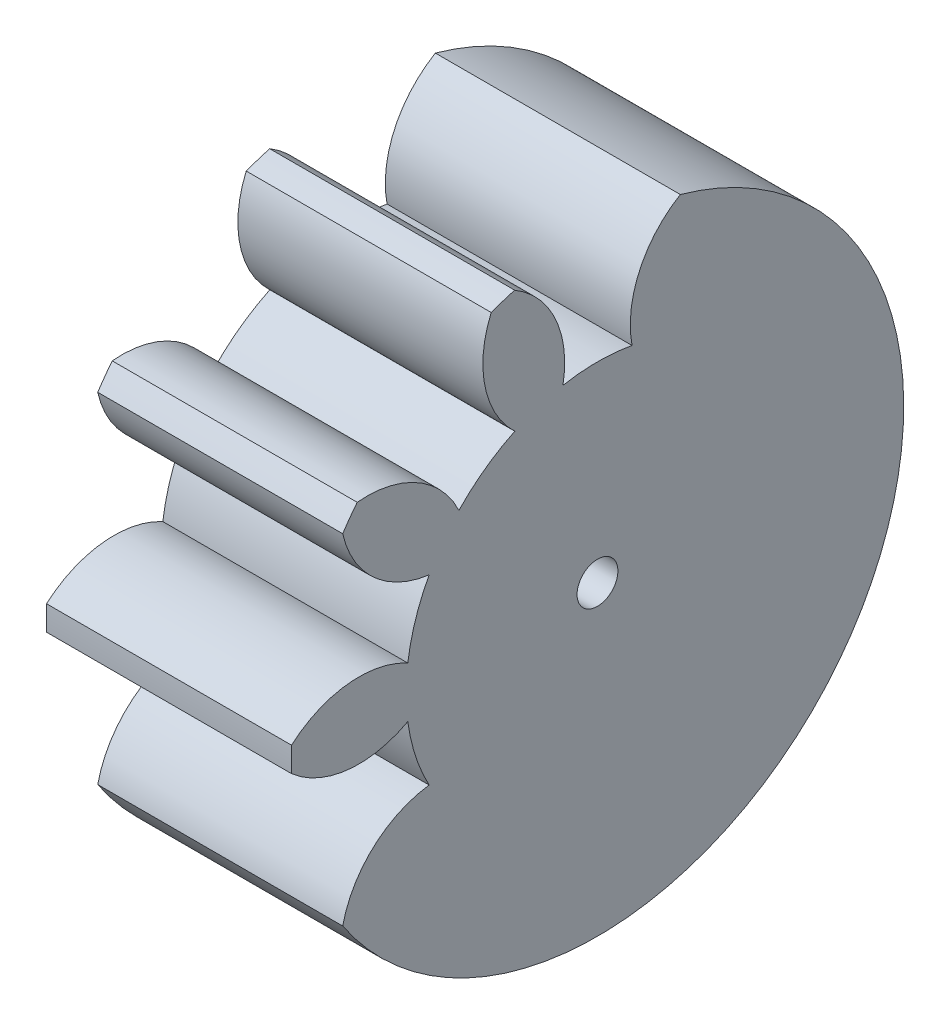
ISO-10303-21;
HEADER;
FILE_DESCRIPTION(('STEP AP214'),'2;1');
FILE_NAME('part.step','',(''),(''),'','','');
FILE_SCHEMA(('AUTOMOTIVE_DESIGN { 1 0 10303 214 1 1 1 1 }'));
ENDSEC;
DATA;
#1=APPLICATION_CONTEXT('core data for automotive mechanical design processes');
#2=APPLICATION_PROTOCOL_DEFINITION('international standard','automotive_design',2000,#1);
#3=PRODUCT_CONTEXT('',#1,'mechanical');
#4=PRODUCT('Part','Part','',(#3));
#5=PRODUCT_RELATED_PRODUCT_CATEGORY('part','',(#4));
#6=PRODUCT_DEFINITION_FORMATION('','',#4);
#7=PRODUCT_DEFINITION_CONTEXT('part definition',#1,'design');
#8=PRODUCT_DEFINITION('design','',#6,#7);
#9=PRODUCT_DEFINITION_SHAPE('','',#8);
#10=(LENGTH_UNIT() NAMED_UNIT(*) SI_UNIT(.MILLI.,.METRE.));
#11=(NAMED_UNIT(*) PLANE_ANGLE_UNIT() SI_UNIT($,.RADIAN.));
#12=(NAMED_UNIT(*) SI_UNIT($,.STERADIAN.) SOLID_ANGLE_UNIT());
#13=UNCERTAINTY_MEASURE_WITH_UNIT(LENGTH_MEASURE(1.E-05),#10,'distance_accuracy_value','');
#14=(GEOMETRIC_REPRESENTATION_CONTEXT(3) GLOBAL_UNCERTAINTY_ASSIGNED_CONTEXT((#13)) GLOBAL_UNIT_ASSIGNED_CONTEXT((#10,
#11,#12)) REPRESENTATION_CONTEXT('',''));
#15=CARTESIAN_POINT('',(0.,0.,0.));
#16=DIRECTION('',(0.,0.,1.));
#17=DIRECTION('',(1.,0.,0.));
#18=AXIS2_PLACEMENT_3D('',#15,#16,#17);
#19=CARTESIAN_POINT('',(12.,0.,0.));
#20=DIRECTION('',(-1.,0.,0.));
#21=DIRECTION('',(0.,0.,1.));
#22=AXIS2_PLACEMENT_3D('',#19,#20,#21);
#23=PLANE('',#22);
#24=CARTESIAN_POINT('',(12.,0.,0.));
#25=DIRECTION('',(-1.,0.,0.));
#26=DIRECTION('',(0.,0.,1.));
#27=AXIS2_PLACEMENT_3D('',#24,#25,#26);
#28=CIRCLE('',#27,0.999999999999999);
#29=CARTESIAN_POINT('',(12.,0.,0.999999999999999));
#30=VERTEX_POINT('',#29);
#31=EDGE_CURVE('E185',#30,#30,#28,.T.);
#32=ORIENTED_EDGE('',*,*,#31,.T.);
#33=EDGE_LOOP('',(#32));
#34=FACE_BOUND('',#33,.T.);
#35=CARTESIAN_POINT('',(12.,9.4163305871234,7.60180129417859));
#36=DIRECTION('',(-1.,0.,0.));
#37=DIRECTION('',(0.,0.951056516295155,-0.309016994374945));
#38=AXIS2_PLACEMENT_3D('',#35,#36,#37);
#39=CIRCLE('',#38,5.);
#40=CARTESIAN_POINT('',(12.,4.45801496955042,8.24608868077857));
#41=VERTEX_POINT('',#40);
#42=CARTESIAN_POINT('',(12.,8.32108039729011,12.4803694264967));
#43=VERTEX_POINT('',#42);
#44=EDGE_CURVE('E157',#41,#43,#39,.T.);
#45=ORIENTED_EDGE('',*,*,#44,.F.);
#46=CARTESIAN_POINT('',(12.,0.,0.));
#47=DIRECTION('',(-1.,0.,0.));
#48=DIRECTION('',(0.,0.951056516295155,-0.309016994374945));
#49=AXIS2_PLACEMENT_3D('',#46,#47,#48);
#50=CIRCLE('',#49,9.374);
#51=CARTESIAN_POINT('',(12.,1.24031944411328,9.29158133347357));
#52=VERTEX_POINT('',#51);
#53=EDGE_CURVE('E156',#52,#41,#50,.T.);
#54=ORIENTED_EDGE('',*,*,#53,.F.);
#55=CARTESIAN_POINT('',(12.,-3.14974477805952,11.6847666846736));
#56=DIRECTION('',(-1.,0.,0.));
#57=DIRECTION('',(0.,0.951056516295155,-0.309016994374945));
#58=AXIS2_PLACEMENT_3D('',#55,#56,#57);
#59=CIRCLE('',#58,5.);
#60=CARTESIAN_POINT('',(12.,0.603881639088625,14.9878393027805));
#61=VERTEX_POINT('',#60);
#62=EDGE_CURVE('E145',#61,#52,#59,.T.);
#63=ORIENTED_EDGE('',*,*,#62,.F.);
#64=CARTESIAN_POINT('',(12.,0.,0.));
#65=DIRECTION('',(-1.,0.,0.));
#66=DIRECTION('',(0.,0.,1.));
#67=AXIS2_PLACEMENT_3D('',#64,#65,#66);
#68=CIRCLE('',#67,15.);
#69=CARTESIAN_POINT('',(12.,-0.603881639088732,14.9878393027805));
#70=VERTEX_POINT('',#69);
#71=EDGE_CURVE('E251',#70,#61,#68,.T.);
#72=ORIENTED_EDGE('',*,*,#71,.F.);
#73=CARTESIAN_POINT('',(12.,3.14974477805943,11.6847666846736));
#74=DIRECTION('',(-1.,0.,0.));
#75=DIRECTION('',(0.,0.951056516295152,0.309016994374952));
#76=AXIS2_PLACEMENT_3D('',#73,#74,#75);
#77=CIRCLE('',#76,5.);
#78=CARTESIAN_POINT('',(12.,-1.24031944411335,9.29158133347356));
#79=VERTEX_POINT('',#78);
#80=EDGE_CURVE('E176',#79,#70,#77,.T.);
#81=ORIENTED_EDGE('',*,*,#80,.F.);
#82=CARTESIAN_POINT('',(12.,0.,0.));
#83=DIRECTION('',(-1.,0.,0.));
#84=DIRECTION('',(0.,0.951056516295152,0.309016994374952));
#85=AXIS2_PLACEMENT_3D('',#82,#83,#84);
#86=CIRCLE('',#85,9.374);
#87=CARTESIAN_POINT('',(12.,-4.45801496955048,8.24608868077853));
#88=VERTEX_POINT('',#87);
#89=EDGE_CURVE('E181',#88,#79,#86,.T.);
#90=ORIENTED_EDGE('',*,*,#89,.F.);
#91=CARTESIAN_POINT('',(12.,-9.41633058712346,7.60180129417852));
#92=DIRECTION('',(-1.,0.,0.));
#93=DIRECTION('',(0.,0.951056516295152,0.309016994374952));
#94=AXIS2_PLACEMENT_3D('',#91,#92,#93);
#95=CIRCLE('',#94,5.);
#96=CARTESIAN_POINT('',(12.,-8.3210803972902,12.4803694264967));
#97=VERTEX_POINT('',#96);
#98=EDGE_CURVE('E178',#97,#88,#95,.T.);
#99=ORIENTED_EDGE('',*,*,#98,.F.);
#100=CARTESIAN_POINT('',(12.,14.4408919231634,-4.05717148559366));
#101=VERTEX_POINT('',#100);
#102=EDGE_CURVE('E247',#101,#97,#68,.T.);
#103=ORIENTED_EDGE('',*,*,#102,.F.);
#104=CARTESIAN_POINT('',(12.,10.1395488324832,-6.60637677671046));
#105=DIRECTION('',(-1.,0.,0.));
#106=DIRECTION('',(0.,0.,-1.));
#107=AXIS2_PLACEMENT_3D('',#104,#105,#106);
#108=CIRCLE('',#107,5.);
#109=CARTESIAN_POINT('',(12.,9.22009876057115,-1.69164264704882));
#110=VERTEX_POINT('',#109);
#111=EDGE_CURVE('E219',#110,#101,#108,.T.);
#112=ORIENTED_EDGE('',*,*,#111,.F.);
#113=CARTESIAN_POINT('',(12.,0.,0.));
#114=DIRECTION('',(-1.,0.,0.));
#115=DIRECTION('',(0.,0.,-1.));
#116=AXIS2_PLACEMENT_3D('',#113,#114,#115);
#117=CIRCLE('',#116,9.374);
#118=CARTESIAN_POINT('',(12.,9.22009876057115,1.69164264704882));
#119=VERTEX_POINT('',#118);
#120=EDGE_CURVE('E224',#119,#110,#117,.T.);
#121=ORIENTED_EDGE('',*,*,#120,.F.);
#122=CARTESIAN_POINT('',(12.,10.1395488324832,6.60637677671046));
#123=DIRECTION('',(-1.,0.,0.));
#124=DIRECTION('',(0.,0.,-1.));
#125=AXIS2_PLACEMENT_3D('',#122,#123,#124);
#126=CIRCLE('',#125,5.);
#127=CARTESIAN_POINT('',(12.,14.4408919231634,4.05717148559366));
#128=VERTEX_POINT('',#127);
#129=EDGE_CURVE('E221',#128,#119,#126,.T.);
#130=ORIENTED_EDGE('',*,*,#129,.F.);
#131=CARTESIAN_POINT('',(12.,14.0676725450246,5.20582262144623));
#132=VERTEX_POINT('',#131);
#133=EDGE_CURVE('E244',#132,#128,#68,.T.);
#134=ORIENTED_EDGE('',*,*,#133,.F.);
#135=CARTESIAN_POINT('',(12.,12.0861981612115,0.615206185030265));
#136=DIRECTION('',(-1.,0.,0.));
#137=DIRECTION('',(0.,0.587785252292474,-0.809016994374947));
#138=AXIS2_PLACEMENT_3D('',#135,#136,#137);
#139=CIRCLE('',#138,5.);
#140=CARTESIAN_POINT('',(12.,8.45353918720174,4.05087042627193));
#141=VERTEX_POINT('',#140);
#142=EDGE_CURVE('E197',#141,#132,#139,.T.);
#143=ORIENTED_EDGE('',*,*,#142,.F.);
#144=CARTESIAN_POINT('',(12.,0.,0.));
#145=DIRECTION('',(-1.,0.,0.));
#146=DIRECTION('',(0.,0.587785252292474,-0.809016994374947));
#147=AXIS2_PLACEMENT_3D('',#144,#145,#146);
#148=CIRCLE('',#147,9.374);
#149=CARTESIAN_POINT('',(12.,6.46489398703314,6.78800572601576));
#150=VERTEX_POINT('',#149);
#151=EDGE_CURVE('E202',#150,#141,#148,.T.);
#152=ORIENTED_EDGE('',*,*,#151,.F.);
#153=CARTESIAN_POINT('',(12.,4.31993648033567,11.3045483522358));
#154=DIRECTION('',(-1.,0.,0.));
#155=DIRECTION('',(0.,0.587785252292474,-0.809016994374947));
#156=AXIS2_PLACEMENT_3D('',#153,#154,#155);
#157=CIRCLE('',#156,5.);
#158=CARTESIAN_POINT('',(12.,9.29818141451759,11.7704639833237));
#159=VERTEX_POINT('',#158);
#160=EDGE_CURVE('E199',#159,#150,#157,.T.);
#161=ORIENTED_EDGE('',*,*,#160,.F.);
#162=EDGE_CURVE('E252',#43,#159,#68,.T.);
#163=ORIENTED_EDGE('',*,*,#162,.F.);
#164=EDGE_LOOP('',(#45,#54,#63,#72,#81,#90,#99,#103,#112,#121,#130,#134,#143,#152,#161,#163));
#165=FACE_BOUND('',#164,.T.);
#166=ADVANCED_FACE('F33',(#34,#165),#23,.F.);
#167=CARTESIAN_POINT('',(-10.,0.,0.));
#168=DIRECTION('',(-1.,0.,0.));
#169=DIRECTION('',(0.,0.,1.));
#170=AXIS2_PLACEMENT_3D('',#167,#168,#169);
#171=CYLINDRICAL_SURFACE('',#170,15.);
#172=DIRECTION('',(-1.,0.,0.));
#173=VECTOR('',#172,1.);
#174=CARTESIAN_POINT('',(6.,8.32108039729011,12.4803694264967));
#175=LINE('',#174,#173);
#176=CARTESIAN_POINT('',(0.,8.32108039729011,12.4803694264967));
#177=VERTEX_POINT('',#176);
#178=EDGE_CURVE('E194',#43,#177,#175,.T.);
#179=ORIENTED_EDGE('',*,*,#178,.F.);
#180=ORIENTED_EDGE('',*,*,#162,.T.);
#181=DIRECTION('',(-1.,0.,0.));
#182=VECTOR('',#181,1.);
#183=CARTESIAN_POINT('',(6.,9.29818141451759,11.7704639833237));
#184=LINE('',#183,#182);
#185=CARTESIAN_POINT('',(0.,9.29818141451759,11.7704639833237));
#186=VERTEX_POINT('',#185);
#187=EDGE_CURVE('E213',#186,#159,#184,.F.);
#188=ORIENTED_EDGE('',*,*,#187,.F.);
#189=CARTESIAN_POINT('',(0.,0.,0.));
#190=DIRECTION('',(-1.,0.,0.));
#191=DIRECTION('',(0.,0.,1.));
#192=AXIS2_PLACEMENT_3D('',#189,#190,#191);
#193=CIRCLE('',#192,15.);
#194=EDGE_CURVE('E246',#177,#186,#193,.T.);
#195=ORIENTED_EDGE('',*,*,#194,.F.);
#196=EDGE_LOOP('',(#179,#180,#188,#195));
#197=FACE_BOUND('',#196,.T.);
#198=ADVANCED_FACE('F313',(#197),#171,.T.);
#199=DIRECTION('',(-1.,0.,0.));
#200=VECTOR('',#199,1.);
#201=CARTESIAN_POINT('',(6.,0.603881639088625,14.9878393027805));
#202=LINE('',#201,#200);
#203=CARTESIAN_POINT('',(0.,0.603881639088625,14.9878393027805));
#204=VERTEX_POINT('',#203);
#205=EDGE_CURVE('E151',#204,#61,#202,.F.);
#206=ORIENTED_EDGE('',*,*,#205,.F.);
#207=CARTESIAN_POINT('',(0.,-0.603881639088732,14.9878393027805));
#208=VERTEX_POINT('',#207);
#209=EDGE_CURVE('E245',#208,#204,#193,.T.);
#210=ORIENTED_EDGE('',*,*,#209,.F.);
#211=DIRECTION('',(-1.,0.,0.));
#212=VECTOR('',#211,1.);
#213=CARTESIAN_POINT('',(6.,-0.603881639088732,14.9878393027805));
#214=LINE('',#213,#212);
#215=EDGE_CURVE('E191',#70,#208,#214,.T.);
#216=ORIENTED_EDGE('',*,*,#215,.F.);
#217=ORIENTED_EDGE('',*,*,#71,.T.);
#218=EDGE_LOOP('',(#206,#210,#216,#217));
#219=FACE_BOUND('',#218,.T.);
#220=ADVANCED_FACE('F291',(#219),#171,.T.);
#221=DIRECTION('',(-1.,0.,0.));
#222=VECTOR('',#221,1.);
#223=CARTESIAN_POINT('',(6.,-8.3210803972902,12.4803694264967));
#224=LINE('',#223,#222);
#225=CARTESIAN_POINT('',(0.,-8.3210803972902,12.4803694264967));
#226=VERTEX_POINT('',#225);
#227=EDGE_CURVE('E164',#226,#97,#224,.F.);
#228=ORIENTED_EDGE('',*,*,#227,.F.);
#229=CARTESIAN_POINT('',(0.,14.4408919231634,-4.05717148559366));
#230=VERTEX_POINT('',#229);
#231=EDGE_CURVE('E241',#230,#226,#193,.T.);
#232=ORIENTED_EDGE('',*,*,#231,.F.);
#233=DIRECTION('',(-1.,0.,0.));
#234=VECTOR('',#233,1.);
#235=CARTESIAN_POINT('',(6.,14.4408919231634,-4.05717148559366));
#236=LINE('',#235,#234);
#237=EDGE_CURVE('E238',#101,#230,#236,.T.);
#238=ORIENTED_EDGE('',*,*,#237,.F.);
#239=ORIENTED_EDGE('',*,*,#102,.T.);
#240=EDGE_LOOP('',(#228,#232,#238,#239));
#241=FACE_BOUND('',#240,.T.);
#242=ADVANCED_FACE('F267',(#241),#171,.T.);
#243=CARTESIAN_POINT('',(0.,0.,0.));
#244=DIRECTION('',(1.,0.,0.));
#245=DIRECTION('',(0.,0.,-1.));
#246=AXIS2_PLACEMENT_3D('',#243,#244,#245);
#247=PLANE('',#246);
#248=CARTESIAN_POINT('',(0.,0.,0.));
#249=DIRECTION('',(-1.,0.,0.));
#250=DIRECTION('',(0.,0.,1.));
#251=AXIS2_PLACEMENT_3D('',#248,#249,#250);
#252=CIRCLE('',#251,0.999999999999999);
#253=CARTESIAN_POINT('',(0.,0.,0.999999999999999));
#254=VERTEX_POINT('',#253);
#255=EDGE_CURVE('E322',#254,#254,#252,.T.);
#256=ORIENTED_EDGE('',*,*,#255,.F.);
#257=EDGE_LOOP('',(#256));
#258=FACE_BOUND('',#257,.T.);
#259=CARTESIAN_POINT('',(0.,9.4163305871234,7.60180129417859));
#260=DIRECTION('',(-1.,0.,0.));
#261=DIRECTION('',(0.,0.951056516295155,-0.309016994374945));
#262=AXIS2_PLACEMENT_3D('',#259,#260,#261);
#263=CIRCLE('',#262,5.);
#264=CARTESIAN_POINT('',(0.,4.45801496955042,8.24608868077856));
#265=VERTEX_POINT('',#264);
#266=EDGE_CURVE('E47',#265,#177,#263,.T.);
#267=ORIENTED_EDGE('',*,*,#266,.T.);
#268=ORIENTED_EDGE('',*,*,#194,.T.);
#269=CARTESIAN_POINT('',(0.,4.31993648033567,11.3045483522358));
#270=DIRECTION('',(1.,0.,0.));
#271=DIRECTION('',(0.,0.,-1.));
#272=AXIS2_PLACEMENT_3D('',#269,#270,#271);
#273=CIRCLE('',#272,5.);
#274=CARTESIAN_POINT('',(0.,6.46489398703314,6.78800572601576));
#275=VERTEX_POINT('',#274);
#276=EDGE_CURVE('E255',#275,#186,#273,.T.);
#277=ORIENTED_EDGE('',*,*,#276,.F.);
#278=CARTESIAN_POINT('',(0.,0.,0.));
#279=DIRECTION('',(-1.,0.,0.));
#280=DIRECTION('',(0.,0.587785252292474,-0.809016994374947));
#281=AXIS2_PLACEMENT_3D('',#278,#279,#280);
#282=CIRCLE('',#281,9.374);
#283=CARTESIAN_POINT('',(0.,8.45353918720174,4.05087042627192));
#284=VERTEX_POINT('',#283);
#285=EDGE_CURVE('E200',#275,#284,#282,.T.);
#286=ORIENTED_EDGE('',*,*,#285,.T.);
#287=CARTESIAN_POINT('',(0.,12.0861981612115,0.615206185030265));
#288=DIRECTION('',(-1.,0.,0.));
#289=DIRECTION('',(0.,0.587785252292474,-0.809016994374947));
#290=AXIS2_PLACEMENT_3D('',#287,#288,#289);
#291=CIRCLE('',#290,5.);
#292=CARTESIAN_POINT('',(0.,14.0676725450246,5.20582262144623));
#293=VERTEX_POINT('',#292);
#294=EDGE_CURVE('E196',#284,#293,#291,.T.);
#295=ORIENTED_EDGE('',*,*,#294,.T.);
#296=CARTESIAN_POINT('',(0.,14.4408919231634,4.05717148559366));
#297=VERTEX_POINT('',#296);
#298=EDGE_CURVE('E240',#293,#297,#193,.T.);
#299=ORIENTED_EDGE('',*,*,#298,.T.);
#300=CARTESIAN_POINT('',(0.,10.1395488324832,6.60637677671046));
#301=DIRECTION('',(1.,0.,0.));
#302=DIRECTION('',(0.,0.,-1.));
#303=AXIS2_PLACEMENT_3D('',#300,#301,#302);
#304=CIRCLE('',#303,5.);
#305=CARTESIAN_POINT('',(0.,9.22009876057115,1.69164264704882));
#306=VERTEX_POINT('',#305);
#307=EDGE_CURVE('E250',#306,#297,#304,.T.);
#308=ORIENTED_EDGE('',*,*,#307,.F.);
#309=CARTESIAN_POINT('',(0.,0.,0.));
#310=DIRECTION('',(-1.,0.,0.));
#311=DIRECTION('',(0.,0.,-1.));
#312=AXIS2_PLACEMENT_3D('',#309,#310,#311);
#313=CIRCLE('',#312,9.374);
#314=CARTESIAN_POINT('',(0.,9.22009876057115,-1.69164264704882));
#315=VERTEX_POINT('',#314);
#316=EDGE_CURVE('E222',#306,#315,#313,.T.);
#317=ORIENTED_EDGE('',*,*,#316,.T.);
#318=CARTESIAN_POINT('',(0.,10.1395488324832,-6.60637677671046));
#319=DIRECTION('',(-1.,0.,0.));
#320=DIRECTION('',(0.,0.,-1.));
#321=AXIS2_PLACEMENT_3D('',#318,#319,#320);
#322=CIRCLE('',#321,5.);
#323=EDGE_CURVE('E218',#315,#230,#322,.T.);
#324=ORIENTED_EDGE('',*,*,#323,.T.);
#325=ORIENTED_EDGE('',*,*,#231,.T.);
#326=CARTESIAN_POINT('',(0.,-9.41633058712346,7.60180129417852));
#327=DIRECTION('',(1.,0.,0.));
#328=DIRECTION('',(0.,0.,-1.));
#329=AXIS2_PLACEMENT_3D('',#326,#327,#328);
#330=CIRCLE('',#329,5.);
#331=CARTESIAN_POINT('',(0.,-4.45801496955048,8.24608868077853));
#332=VERTEX_POINT('',#331);
#333=EDGE_CURVE('E40',#332,#226,#330,.T.);
#334=ORIENTED_EDGE('',*,*,#333,.F.);
#335=CARTESIAN_POINT('',(0.,0.,0.));
#336=DIRECTION('',(-1.,0.,0.));
#337=DIRECTION('',(0.,0.951056516295152,0.309016994374952));
#338=AXIS2_PLACEMENT_3D('',#335,#336,#337);
#339=CIRCLE('',#338,9.374);
#340=CARTESIAN_POINT('',(0.,-1.24031944411335,9.29158133347356));
#341=VERTEX_POINT('',#340);
#342=EDGE_CURVE('E179',#332,#341,#339,.T.);
#343=ORIENTED_EDGE('',*,*,#342,.T.);
#344=CARTESIAN_POINT('',(0.,3.14974477805943,11.6847666846736));
#345=DIRECTION('',(-1.,0.,0.));
#346=DIRECTION('',(0.,0.951056516295152,0.309016994374952));
#347=AXIS2_PLACEMENT_3D('',#344,#345,#346);
#348=CIRCLE('',#347,5.);
#349=EDGE_CURVE('E55',#341,#208,#348,.T.);
#350=ORIENTED_EDGE('',*,*,#349,.T.);
#351=ORIENTED_EDGE('',*,*,#209,.T.);
#352=CARTESIAN_POINT('',(0.,-3.14974477805952,11.6847666846736));
#353=DIRECTION('',(1.,0.,0.));
#354=DIRECTION('',(0.,0.,-1.));
#355=AXIS2_PLACEMENT_3D('',#352,#353,#354);
#356=CIRCLE('',#355,5.);
#357=CARTESIAN_POINT('',(0.,1.24031944411328,9.29158133347357));
#358=VERTEX_POINT('',#357);
#359=EDGE_CURVE('E11',#358,#204,#356,.T.);
#360=ORIENTED_EDGE('',*,*,#359,.F.);
#361=CARTESIAN_POINT('',(0.,0.,0.));
#362=DIRECTION('',(-1.,0.,0.));
#363=DIRECTION('',(0.,0.951056516295155,-0.309016994374945));
#364=AXIS2_PLACEMENT_3D('',#361,#362,#363);
#365=CIRCLE('',#364,9.374);
#366=EDGE_CURVE('E162',#358,#265,#365,.T.);
#367=ORIENTED_EDGE('',*,*,#366,.T.);
#368=EDGE_LOOP('',(#267,#268,#277,#286,#295,#299,#308,#317,#324,#325,#334,#343,#350,#351,#360,#367));
#369=FACE_BOUND('',#368,.T.);
#370=ADVANCED_FACE('F270',(#258,#369),#247,.F.);
#371=DIRECTION('',(-1.,0.,0.));
#372=VECTOR('',#371,1.);
#373=CARTESIAN_POINT('',(6.,14.0676725450246,5.20582262144623));
#374=LINE('',#373,#372);
#375=EDGE_CURVE('E216',#132,#293,#374,.T.);
#376=ORIENTED_EDGE('',*,*,#375,.F.);
#377=ORIENTED_EDGE('',*,*,#133,.T.);
#378=DIRECTION('',(-1.,0.,0.));
#379=VECTOR('',#378,1.);
#380=CARTESIAN_POINT('',(6.,14.4408919231634,4.05717148559366));
#381=LINE('',#380,#379);
#382=EDGE_CURVE('E235',#297,#128,#381,.F.);
#383=ORIENTED_EDGE('',*,*,#382,.F.);
#384=ORIENTED_EDGE('',*,*,#298,.F.);
#385=EDGE_LOOP('',(#376,#377,#383,#384));
#386=FACE_BOUND('',#385,.T.);
#387=ADVANCED_FACE('F298',(#386),#171,.T.);
#388=CARTESIAN_POINT('',(12.,10.1395488324832,-6.60637677671046));
#389=DIRECTION('',(-1.,0.,0.));
#390=DIRECTION('',(0.,0.,1.));
#391=AXIS2_PLACEMENT_3D('',#388,#389,#390);
#392=CYLINDRICAL_SURFACE('',#391,5.);
#393=ORIENTED_EDGE('',*,*,#237,.T.);
#394=ORIENTED_EDGE('',*,*,#323,.F.);
#395=DIRECTION('',(-1.,0.,0.));
#396=VECTOR('',#395,1.);
#397=CARTESIAN_POINT('',(12.,9.22009876057115,-1.69164264704882));
#398=LINE('',#397,#396);
#399=EDGE_CURVE('E226',#110,#315,#398,.T.);
#400=ORIENTED_EDGE('',*,*,#399,.F.);
#401=ORIENTED_EDGE('',*,*,#111,.T.);
#402=EDGE_LOOP('',(#393,#394,#400,#401));
#403=FACE_BOUND('',#402,.T.);
#404=ADVANCED_FACE('F275',(#403),#392,.T.);
#405=CARTESIAN_POINT('',(12.,10.1395488324832,6.60637677671046));
#406=DIRECTION('',(-1.,0.,0.));
#407=DIRECTION('',(0.,0.,1.));
#408=AXIS2_PLACEMENT_3D('',#405,#406,#407);
#409=CYLINDRICAL_SURFACE('',#408,5.);
#410=ORIENTED_EDGE('',*,*,#382,.T.);
#411=ORIENTED_EDGE('',*,*,#129,.T.);
#412=DIRECTION('',(-1.,0.,0.));
#413=VECTOR('',#412,1.);
#414=CARTESIAN_POINT('',(12.,9.22009876057115,1.69164264704882));
#415=LINE('',#414,#413);
#416=EDGE_CURVE('E233',#119,#306,#415,.T.);
#417=ORIENTED_EDGE('',*,*,#416,.T.);
#418=ORIENTED_EDGE('',*,*,#307,.T.);
#419=EDGE_LOOP('',(#410,#411,#417,#418));
#420=FACE_BOUND('',#419,.T.);
#421=ADVANCED_FACE('F297',(#420),#409,.T.);
#422=CARTESIAN_POINT('',(12.,0.,0.));
#423=DIRECTION('',(-1.,0.,0.));
#424=DIRECTION('',(0.,0.,1.));
#425=AXIS2_PLACEMENT_3D('',#422,#423,#424);
#426=CYLINDRICAL_SURFACE('',#425,9.374);
#427=ORIENTED_EDGE('',*,*,#316,.F.);
#428=ORIENTED_EDGE('',*,*,#416,.F.);
#429=ORIENTED_EDGE('',*,*,#120,.T.);
#430=ORIENTED_EDGE('',*,*,#399,.T.);
#431=EDGE_LOOP('',(#427,#428,#429,#430));
#432=FACE_BOUND('',#431,.T.);
#433=ADVANCED_FACE('F278',(#432),#426,.T.);
#434=CARTESIAN_POINT('',(12.,12.0861981612115,0.615206185030265));
#435=DIRECTION('',(-1.,0.,0.));
#436=DIRECTION('',(0.,0.,1.));
#437=AXIS2_PLACEMENT_3D('',#434,#435,#436);
#438=CYLINDRICAL_SURFACE('',#437,5.);
#439=ORIENTED_EDGE('',*,*,#375,.T.);
#440=ORIENTED_EDGE('',*,*,#294,.F.);
#441=DIRECTION('',(-1.,0.,0.));
#442=VECTOR('',#441,1.);
#443=CARTESIAN_POINT('',(12.,8.45353918720174,4.05087042627193));
#444=LINE('',#443,#442);
#445=EDGE_CURVE('E204',#141,#284,#444,.T.);
#446=ORIENTED_EDGE('',*,*,#445,.F.);
#447=ORIENTED_EDGE('',*,*,#142,.T.);
#448=EDGE_LOOP('',(#439,#440,#446,#447));
#449=FACE_BOUND('',#448,.T.);
#450=ADVANCED_FACE('F338',(#449),#438,.T.);
#451=CARTESIAN_POINT('',(12.,4.31993648033567,11.3045483522358));
#452=DIRECTION('',(-1.,0.,0.));
#453=DIRECTION('',(0.,0.,1.));
#454=AXIS2_PLACEMENT_3D('',#451,#452,#453);
#455=CYLINDRICAL_SURFACE('',#454,5.);
#456=ORIENTED_EDGE('',*,*,#187,.T.);
#457=ORIENTED_EDGE('',*,*,#160,.T.);
#458=DIRECTION('',(-1.,0.,0.));
#459=VECTOR('',#458,1.);
#460=CARTESIAN_POINT('',(12.,6.46489398703314,6.78800572601576));
#461=LINE('',#460,#459);
#462=EDGE_CURVE('E211',#150,#275,#461,.T.);
#463=ORIENTED_EDGE('',*,*,#462,.T.);
#464=ORIENTED_EDGE('',*,*,#276,.T.);
#465=EDGE_LOOP('',(#456,#457,#463,#464));
#466=FACE_BOUND('',#465,.T.);
#467=ADVANCED_FACE('F309',(#466),#455,.T.);
#468=CARTESIAN_POINT('',(12.,0.,0.));
#469=DIRECTION('',(-1.,0.,0.));
#470=DIRECTION('',(0.,0.,1.));
#471=AXIS2_PLACEMENT_3D('',#468,#469,#470);
#472=CYLINDRICAL_SURFACE('',#471,9.374);
#473=ORIENTED_EDGE('',*,*,#285,.F.);
#474=ORIENTED_EDGE('',*,*,#462,.F.);
#475=ORIENTED_EDGE('',*,*,#151,.T.);
#476=ORIENTED_EDGE('',*,*,#445,.T.);
#477=EDGE_LOOP('',(#473,#474,#475,#476));
#478=FACE_BOUND('',#477,.T.);
#479=ADVANCED_FACE('F302',(#478),#472,.T.);
#480=CARTESIAN_POINT('',(12.,3.14974477805943,11.6847666846736));
#481=DIRECTION('',(-1.,0.,0.));
#482=DIRECTION('',(0.,0.,1.));
#483=AXIS2_PLACEMENT_3D('',#480,#481,#482);
#484=CYLINDRICAL_SURFACE('',#483,5.);
#485=ORIENTED_EDGE('',*,*,#215,.T.);
#486=ORIENTED_EDGE('',*,*,#349,.F.);
#487=DIRECTION('',(-1.,0.,0.));
#488=VECTOR('',#487,1.);
#489=CARTESIAN_POINT('',(12.,-1.24031944411335,9.29158133347356));
#490=LINE('',#489,#488);
#491=EDGE_CURVE('E183',#79,#341,#490,.T.);
#492=ORIENTED_EDGE('',*,*,#491,.F.);
#493=ORIENTED_EDGE('',*,*,#80,.T.);
#494=EDGE_LOOP('',(#485,#486,#492,#493));
#495=FACE_BOUND('',#494,.T.);
#496=ADVANCED_FACE('F300',(#495),#484,.T.);
#497=CARTESIAN_POINT('',(12.,-9.41633058712346,7.60180129417852));
#498=DIRECTION('',(-1.,0.,0.));
#499=DIRECTION('',(0.,0.,1.));
#500=AXIS2_PLACEMENT_3D('',#497,#498,#499);
#501=CYLINDRICAL_SURFACE('',#500,5.);
#502=ORIENTED_EDGE('',*,*,#227,.T.);
#503=ORIENTED_EDGE('',*,*,#98,.T.);
#504=DIRECTION('',(-1.,0.,0.));
#505=VECTOR('',#504,1.);
#506=CARTESIAN_POINT('',(12.,-4.45801496955048,8.24608868077853));
#507=LINE('',#506,#505);
#508=EDGE_CURVE('E174',#88,#332,#507,.T.);
#509=ORIENTED_EDGE('',*,*,#508,.T.);
#510=ORIENTED_EDGE('',*,*,#333,.T.);
#511=EDGE_LOOP('',(#502,#503,#509,#510));
#512=FACE_BOUND('',#511,.T.);
#513=ADVANCED_FACE('F260',(#512),#501,.T.);
#514=CARTESIAN_POINT('',(12.,0.,0.));
#515=DIRECTION('',(-1.,0.,0.));
#516=DIRECTION('',(0.,0.,1.));
#517=AXIS2_PLACEMENT_3D('',#514,#515,#516);
#518=CYLINDRICAL_SURFACE('',#517,9.374);
#519=ORIENTED_EDGE('',*,*,#342,.F.);
#520=ORIENTED_EDGE('',*,*,#508,.F.);
#521=ORIENTED_EDGE('',*,*,#89,.T.);
#522=ORIENTED_EDGE('',*,*,#491,.T.);
#523=EDGE_LOOP('',(#519,#520,#521,#522));
#524=FACE_BOUND('',#523,.T.);
#525=ADVANCED_FACE('F286',(#524),#518,.T.);
#526=CARTESIAN_POINT('',(12.,9.4163305871234,7.60180129417859));
#527=DIRECTION('',(-1.,0.,0.));
#528=DIRECTION('',(0.,0.,1.));
#529=AXIS2_PLACEMENT_3D('',#526,#527,#528);
#530=CYLINDRICAL_SURFACE('',#529,5.);
#531=ORIENTED_EDGE('',*,*,#178,.T.);
#532=ORIENTED_EDGE('',*,*,#266,.F.);
#533=DIRECTION('',(-1.,0.,0.));
#534=VECTOR('',#533,1.);
#535=CARTESIAN_POINT('',(12.,4.45801496955042,8.24608868077857));
#536=LINE('',#535,#534);
#537=EDGE_CURVE('E165',#41,#265,#536,.T.);
#538=ORIENTED_EDGE('',*,*,#537,.F.);
#539=ORIENTED_EDGE('',*,*,#44,.T.);
#540=EDGE_LOOP('',(#531,#532,#538,#539));
#541=FACE_BOUND('',#540,.T.);
#542=ADVANCED_FACE('F327',(#541),#530,.T.);
#543=CARTESIAN_POINT('',(12.,-3.14974477805952,11.6847666846736));
#544=DIRECTION('',(-1.,0.,0.));
#545=DIRECTION('',(0.,0.,1.));
#546=AXIS2_PLACEMENT_3D('',#543,#544,#545);
#547=CYLINDRICAL_SURFACE('',#546,5.);
#548=ORIENTED_EDGE('',*,*,#205,.T.);
#549=ORIENTED_EDGE('',*,*,#62,.T.);
#550=DIRECTION('',(-1.,0.,0.));
#551=VECTOR('',#550,1.);
#552=CARTESIAN_POINT('',(12.,1.24031944411328,9.29158133347357));
#553=LINE('',#552,#551);
#554=EDGE_CURVE('E148',#52,#358,#553,.T.);
#555=ORIENTED_EDGE('',*,*,#554,.T.);
#556=ORIENTED_EDGE('',*,*,#359,.T.);
#557=EDGE_LOOP('',(#548,#549,#555,#556));
#558=FACE_BOUND('',#557,.T.);
#559=ADVANCED_FACE('F147',(#558),#547,.T.);
#560=CARTESIAN_POINT('',(12.,0.,0.));
#561=DIRECTION('',(-1.,0.,0.));
#562=DIRECTION('',(0.,0.,1.));
#563=AXIS2_PLACEMENT_3D('',#560,#561,#562);
#564=CYLINDRICAL_SURFACE('',#563,9.374);
#565=ORIENTED_EDGE('',*,*,#366,.F.);
#566=ORIENTED_EDGE('',*,*,#554,.F.);
#567=ORIENTED_EDGE('',*,*,#53,.T.);
#568=ORIENTED_EDGE('',*,*,#537,.T.);
#569=EDGE_LOOP('',(#565,#566,#567,#568));
#570=FACE_BOUND('',#569,.T.);
#571=ADVANCED_FACE('F160',(#570),#564,.T.);
#572=CARTESIAN_POINT('',(16.,0.,0.));
#573=DIRECTION('',(-1.,0.,0.));
#574=DIRECTION('',(0.,0.,1.));
#575=AXIS2_PLACEMENT_3D('',#572,#573,#574);
#576=CYLINDRICAL_SURFACE('',#575,0.999999999999999);
#577=ORIENTED_EDGE('',*,*,#255,.T.);
#578=EDGE_LOOP('',(#577));
#579=FACE_BOUND('',#578,.T.);
#580=ORIENTED_EDGE('',*,*,#31,.F.);
#581=EDGE_LOOP('',(#580));
#582=FACE_BOUND('',#581,.T.);
#583=ADVANCED_FACE('F389',(#579,#582),#576,.F.);
#584=CLOSED_SHELL('',(#166,#198,#220,#242,#370,#387,#404,#421,#433,#450,#467,#479,#496,#513,
#525,#542,#559,#571,#583));
#585=MANIFOLD_SOLID_BREP('B2',#584);
#586=ADVANCED_BREP_SHAPE_REPRESENTATION('',(#18,#585),#14);
#587=SHAPE_DEFINITION_REPRESENTATION(#9,#586);
ENDSEC;
END-ISO-10303-21;
